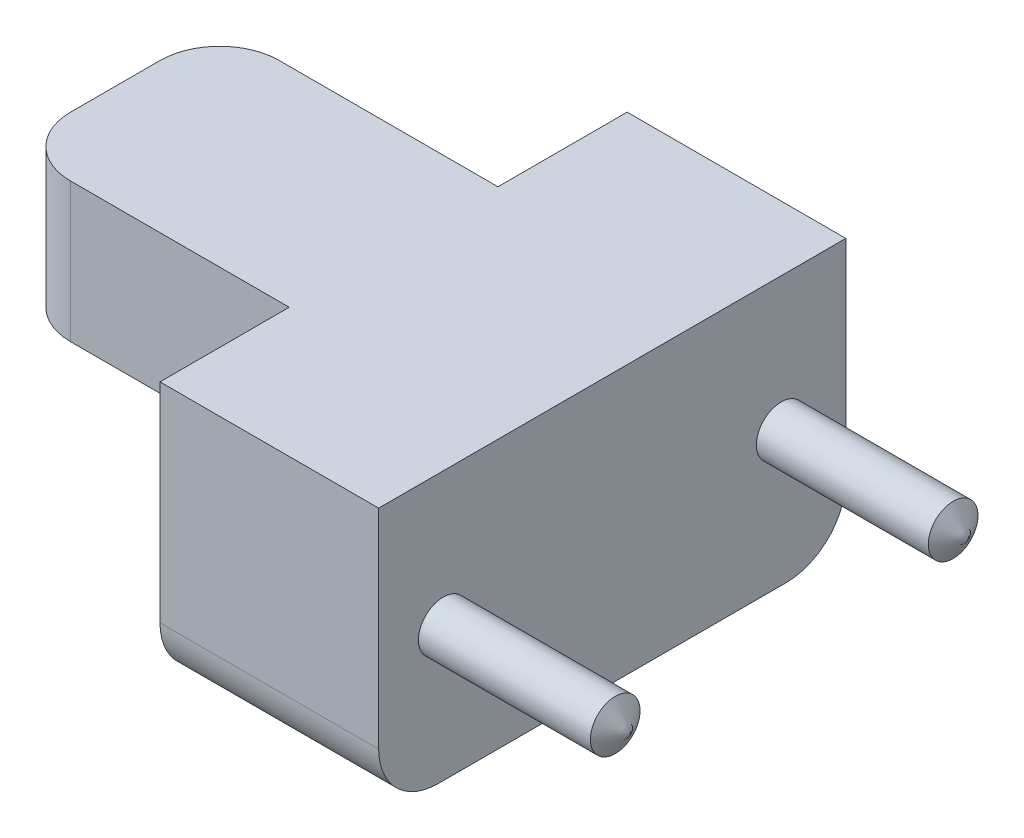
ISO-10303-21;
HEADER;
FILE_DESCRIPTION(('STEP AP214'),'2;1');
FILE_NAME('part.step','',(''),(''),'','','');
FILE_SCHEMA(('AUTOMOTIVE_DESIGN { 1 0 10303 214 1 1 1 1 }'));
ENDSEC;
DATA;
#1=APPLICATION_CONTEXT('core data for automotive mechanical design processes');
#2=APPLICATION_PROTOCOL_DEFINITION('international standard','automotive_design',2000,#1);
#3=PRODUCT_CONTEXT('',#1,'mechanical');
#4=PRODUCT('Part','Part','',(#3));
#5=PRODUCT_RELATED_PRODUCT_CATEGORY('part','',(#4));
#6=PRODUCT_DEFINITION_FORMATION('','',#4);
#7=PRODUCT_DEFINITION_CONTEXT('part definition',#1,'design');
#8=PRODUCT_DEFINITION('design','',#6,#7);
#9=PRODUCT_DEFINITION_SHAPE('','',#8);
#10=(LENGTH_UNIT() NAMED_UNIT(*) SI_UNIT(.MILLI.,.METRE.));
#11=(NAMED_UNIT(*) PLANE_ANGLE_UNIT() SI_UNIT($,.RADIAN.));
#12=(NAMED_UNIT(*) SI_UNIT($,.STERADIAN.) SOLID_ANGLE_UNIT());
#13=UNCERTAINTY_MEASURE_WITH_UNIT(LENGTH_MEASURE(1.E-05),#10,'distance_accuracy_value','');
#14=(GEOMETRIC_REPRESENTATION_CONTEXT(3) GLOBAL_UNCERTAINTY_ASSIGNED_CONTEXT((#13)) GLOBAL_UNIT_ASSIGNED_CONTEXT((#10,
#11,#12)) REPRESENTATION_CONTEXT('',''));
#15=CARTESIAN_POINT('',(0.,0.,0.));
#16=DIRECTION('',(0.,0.,1.));
#17=DIRECTION('',(1.,0.,0.));
#18=AXIS2_PLACEMENT_3D('',#15,#16,#17);
#19=CARTESIAN_POINT('',(0.,27.,-23.501));
#20=DIRECTION('',(1.,0.,0.));
#21=DIRECTION('',(0.,0.,-1.));
#22=AXIS2_PLACEMENT_3D('',#19,#20,#21);
#23=PLANE('',#22);
#24=DIRECTION('',(0.,-1.,0.));
#25=VECTOR('',#24,1.);
#26=CARTESIAN_POINT('',(0.,27.,-10.5));
#27=LINE('',#26,#25);
#28=CARTESIAN_POINT('',(0.,27.,-10.5));
#29=VERTEX_POINT('',#28);
#30=CARTESIAN_POINT('',(0.,13.,-10.5));
#31=VERTEX_POINT('',#30);
#32=EDGE_CURVE('E247',#29,#31,#27,.T.);
#33=ORIENTED_EDGE('',*,*,#32,.F.);
#34=DIRECTION('',(0.,0.,1.));
#35=VECTOR('',#34,1.);
#36=CARTESIAN_POINT('',(0.,27.,-23.501));
#37=LINE('',#36,#35);
#38=CARTESIAN_POINT('',(0.,27.,-23.501));
#39=VERTEX_POINT('',#38);
#40=EDGE_CURVE('E258',#39,#29,#37,.T.);
#41=ORIENTED_EDGE('',*,*,#40,.F.);
#42=DIRECTION('',(0.,-1.,0.));
#43=VECTOR('',#42,1.);
#44=CARTESIAN_POINT('',(0.,27.,-23.501));
#45=LINE('',#44,#43);
#46=CARTESIAN_POINT('',(0.,6.,-23.501));
#47=VERTEX_POINT('',#46);
#48=EDGE_CURVE('E212',#39,#47,#45,.T.);
#49=ORIENTED_EDGE('',*,*,#48,.T.);
#50=CARTESIAN_POINT('',(0.,6.,-17.501));
#51=DIRECTION('',(1.,0.,0.));
#52=DIRECTION('',(0.,0.,-1.));
#53=AXIS2_PLACEMENT_3D('',#50,#51,#52);
#54=CIRCLE('',#53,6.);
#55=CARTESIAN_POINT('',(0.,0.,-17.501));
#56=VERTEX_POINT('',#55);
#57=EDGE_CURVE('E224',#47,#56,#54,.F.);
#58=ORIENTED_EDGE('',*,*,#57,.T.);
#59=DIRECTION('',(0.,0.,1.));
#60=VECTOR('',#59,1.);
#61=CARTESIAN_POINT('',(0.,0.,-23.501));
#62=LINE('',#61,#60);
#63=CARTESIAN_POINT('',(0.,0.,17.501));
#64=VERTEX_POINT('',#63);
#65=EDGE_CURVE('E248',#56,#64,#62,.T.);
#66=ORIENTED_EDGE('',*,*,#65,.T.);
#67=CARTESIAN_POINT('',(0.,6.,17.501));
#68=DIRECTION('',(1.,0.,0.));
#69=DIRECTION('',(0.,0.,-1.));
#70=AXIS2_PLACEMENT_3D('',#67,#68,#69);
#71=CIRCLE('',#70,6.);
#72=CARTESIAN_POINT('',(0.,6.,23.501));
#73=VERTEX_POINT('',#72);
#74=EDGE_CURVE('E226',#64,#73,#71,.F.);
#75=ORIENTED_EDGE('',*,*,#74,.T.);
#76=DIRECTION('',(0.,-1.,0.));
#77=VECTOR('',#76,1.);
#78=CARTESIAN_POINT('',(0.,27.,23.501));
#79=LINE('',#78,#77);
#80=CARTESIAN_POINT('',(0.,27.,23.501));
#81=VERTEX_POINT('',#80);
#82=EDGE_CURVE('E205',#81,#73,#79,.T.);
#83=ORIENTED_EDGE('',*,*,#82,.F.);
#84=CARTESIAN_POINT('',(0.,27.,10.5));
#85=VERTEX_POINT('',#84);
#86=EDGE_CURVE('E262',#85,#81,#37,.T.);
#87=ORIENTED_EDGE('',*,*,#86,.F.);
#88=DIRECTION('',(0.,1.,0.));
#89=VECTOR('',#88,1.);
#90=CARTESIAN_POINT('',(0.,27.,10.5));
#91=LINE('',#90,#89);
#92=CARTESIAN_POINT('',(0.,13.,10.5));
#93=VERTEX_POINT('',#92);
#94=EDGE_CURVE('E284',#93,#85,#91,.T.);
#95=ORIENTED_EDGE('',*,*,#94,.F.);
#96=DIRECTION('',(0.,0.,1.));
#97=VECTOR('',#96,1.);
#98=CARTESIAN_POINT('',(0.,13.,-10.5));
#99=LINE('',#98,#97);
#100=EDGE_CURVE('E288',#31,#93,#99,.T.);
#101=ORIENTED_EDGE('',*,*,#100,.F.);
#102=EDGE_LOOP('',(#33,#41,#49,#58,#66,#75,#83,#87,#95,#101));
#103=FACE_BOUND('',#102,.T.);
#104=ADVANCED_FACE('F34',(#103),#23,.F.);
#105=CARTESIAN_POINT('',(0.,27.,23.501));
#106=DIRECTION('',(0.,0.,-1.));
#107=DIRECTION('',(-1.,0.,0.));
#108=AXIS2_PLACEMENT_3D('',#105,#106,#107);
#109=PLANE('',#108);
#110=ORIENTED_EDGE('',*,*,#82,.T.);
#111=DIRECTION('',(1.,0.,0.));
#112=VECTOR('',#111,1.);
#113=CARTESIAN_POINT('',(0.,6.,23.501));
#114=LINE('',#113,#112);
#115=CARTESIAN_POINT('',(22.,6.,23.501));
#116=VERTEX_POINT('',#115);
#117=EDGE_CURVE('E209',#73,#116,#114,.T.);
#118=ORIENTED_EDGE('',*,*,#117,.T.);
#119=DIRECTION('',(0.,-1.,0.));
#120=VECTOR('',#119,1.);
#121=CARTESIAN_POINT('',(22.,27.,23.501));
#122=LINE('',#121,#120);
#123=CARTESIAN_POINT('',(22.,27.,23.501));
#124=VERTEX_POINT('',#123);
#125=EDGE_CURVE('E197',#124,#116,#122,.T.);
#126=ORIENTED_EDGE('',*,*,#125,.F.);
#127=DIRECTION('',(1.,0.,0.));
#128=VECTOR('',#127,1.);
#129=CARTESIAN_POINT('',(0.,27.,23.501));
#130=LINE('',#129,#128);
#131=EDGE_CURVE('E261',#81,#124,#130,.T.);
#132=ORIENTED_EDGE('',*,*,#131,.F.);
#133=EDGE_LOOP('',(#110,#118,#126,#132));
#134=FACE_BOUND('',#133,.T.);
#135=ADVANCED_FACE('F141',(#134),#109,.F.);
#136=CARTESIAN_POINT('',(22.,27.,-23.501));
#137=DIRECTION('',(-1.,0.,0.));
#138=DIRECTION('',(0.,0.,1.));
#139=AXIS2_PLACEMENT_3D('',#136,#137,#138);
#140=PLANE('',#139);
#141=CARTESIAN_POINT('',(22.,13.5,17.));
#142=DIRECTION('',(-1.,0.,0.));
#143=DIRECTION('',(0.,0.,1.));
#144=AXIS2_PLACEMENT_3D('',#141,#142,#143);
#145=CIRCLE('',#144,2.5);
#146=CARTESIAN_POINT('',(22.,13.5,19.5));
#147=VERTEX_POINT('',#146);
#148=EDGE_CURVE('E11',#147,#147,#145,.F.);
#149=ORIENTED_EDGE('',*,*,#148,.F.);
#150=EDGE_LOOP('',(#149));
#151=FACE_BOUND('',#150,.T.);
#152=CARTESIAN_POINT('',(22.,13.5,-17.));
#153=DIRECTION('',(-1.,0.,0.));
#154=DIRECTION('',(0.,0.,1.));
#155=AXIS2_PLACEMENT_3D('',#152,#153,#154);
#156=CIRCLE('',#155,2.5);
#157=CARTESIAN_POINT('',(22.,13.5,-14.5));
#158=VERTEX_POINT('',#157);
#159=EDGE_CURVE('E42',#158,#158,#156,.F.);
#160=ORIENTED_EDGE('',*,*,#159,.F.);
#161=EDGE_LOOP('',(#160));
#162=FACE_BOUND('',#161,.T.);
#163=ORIENTED_EDGE('',*,*,#125,.T.);
#164=CARTESIAN_POINT('',(22.,6.,17.501));
#165=DIRECTION('',(-1.,0.,0.));
#166=DIRECTION('',(0.,0.,1.));
#167=AXIS2_PLACEMENT_3D('',#164,#165,#166);
#168=CIRCLE('',#167,6.);
#169=CARTESIAN_POINT('',(22.,0.,17.501));
#170=VERTEX_POINT('',#169);
#171=EDGE_CURVE('E199',#116,#170,#168,.F.);
#172=ORIENTED_EDGE('',*,*,#171,.T.);
#173=DIRECTION('',(0.,0.,-1.));
#174=VECTOR('',#173,1.);
#175=CARTESIAN_POINT('',(22.,0.,-23.501));
#176=LINE('',#175,#174);
#177=CARTESIAN_POINT('',(22.,0.,-17.501));
#178=VERTEX_POINT('',#177);
#179=EDGE_CURVE('E252',#170,#178,#176,.T.);
#180=ORIENTED_EDGE('',*,*,#179,.T.);
#181=CARTESIAN_POINT('',(22.,6.,-17.501));
#182=DIRECTION('',(-1.,0.,0.));
#183=DIRECTION('',(0.,0.,1.));
#184=AXIS2_PLACEMENT_3D('',#181,#182,#183);
#185=CIRCLE('',#184,6.);
#186=CARTESIAN_POINT('',(22.,6.,-23.501));
#187=VERTEX_POINT('',#186);
#188=EDGE_CURVE('E217',#178,#187,#185,.F.);
#189=ORIENTED_EDGE('',*,*,#188,.T.);
#190=DIRECTION('',(0.,-1.,0.));
#191=VECTOR('',#190,1.);
#192=CARTESIAN_POINT('',(22.,27.,-23.501));
#193=LINE('',#192,#191);
#194=CARTESIAN_POINT('',(22.,27.,-23.501));
#195=VERTEX_POINT('',#194);
#196=EDGE_CURVE('E206',#195,#187,#193,.T.);
#197=ORIENTED_EDGE('',*,*,#196,.F.);
#198=DIRECTION('',(0.,0.,-1.));
#199=VECTOR('',#198,1.);
#200=CARTESIAN_POINT('',(22.,27.,-23.501));
#201=LINE('',#200,#199);
#202=EDGE_CURVE('E202',#124,#195,#201,.T.);
#203=ORIENTED_EDGE('',*,*,#202,.F.);
#204=EDGE_LOOP('',(#163,#172,#180,#189,#197,#203));
#205=FACE_BOUND('',#204,.T.);
#206=ADVANCED_FACE('F147',(#151,#162,#205),#140,.F.);
#207=CARTESIAN_POINT('',(0.,27.,-23.501));
#208=DIRECTION('',(0.,0.,1.));
#209=DIRECTION('',(1.,0.,0.));
#210=AXIS2_PLACEMENT_3D('',#207,#208,#209);
#211=PLANE('',#210);
#212=ORIENTED_EDGE('',*,*,#196,.T.);
#213=DIRECTION('',(-1.,0.,0.));
#214=VECTOR('',#213,1.);
#215=CARTESIAN_POINT('',(0.,6.,-23.501));
#216=LINE('',#215,#214);
#217=EDGE_CURVE('E228',#187,#47,#216,.T.);
#218=ORIENTED_EDGE('',*,*,#217,.T.);
#219=ORIENTED_EDGE('',*,*,#48,.F.);
#220=DIRECTION('',(-1.,0.,0.));
#221=VECTOR('',#220,1.);
#222=CARTESIAN_POINT('',(0.,27.,-23.501));
#223=LINE('',#222,#221);
#224=EDGE_CURVE('E265',#195,#39,#223,.T.);
#225=ORIENTED_EDGE('',*,*,#224,.F.);
#226=EDGE_LOOP('',(#212,#218,#219,#225));
#227=FACE_BOUND('',#226,.T.);
#228=ADVANCED_FACE('F192',(#227),#211,.F.);
#229=CARTESIAN_POINT('',(0.,27.,0.));
#230=DIRECTION('',(0.,1.,0.));
#231=DIRECTION('',(0.,0.,1.));
#232=AXIS2_PLACEMENT_3D('',#229,#230,#231);
#233=PLANE('',#232);
#234=DIRECTION('',(1.,0.,0.));
#235=VECTOR('',#234,1.);
#236=CARTESIAN_POINT('',(-28.,27.,-10.5));
#237=LINE('',#236,#235);
#238=CARTESIAN_POINT('',(-22.,27.,-10.5));
#239=VERTEX_POINT('',#238);
#240=EDGE_CURVE('E295',#239,#29,#237,.T.);
#241=ORIENTED_EDGE('',*,*,#240,.F.);
#242=CARTESIAN_POINT('',(-22.,27.,-4.5));
#243=DIRECTION('',(0.,1.,0.));
#244=DIRECTION('',(0.,0.,1.));
#245=AXIS2_PLACEMENT_3D('',#242,#243,#244);
#246=CIRCLE('',#245,6.);
#247=CARTESIAN_POINT('',(-28.,27.,-4.5));
#248=VERTEX_POINT('',#247);
#249=EDGE_CURVE('E177',#239,#248,#246,.T.);
#250=ORIENTED_EDGE('',*,*,#249,.T.);
#251=DIRECTION('',(0.,0.,-1.));
#252=VECTOR('',#251,1.);
#253=CARTESIAN_POINT('',(-28.,27.,-10.5));
#254=LINE('',#253,#252);
#255=CARTESIAN_POINT('',(-28.,27.,4.5));
#256=VERTEX_POINT('',#255);
#257=EDGE_CURVE('E290',#256,#248,#254,.T.);
#258=ORIENTED_EDGE('',*,*,#257,.F.);
#259=CARTESIAN_POINT('',(-22.,27.,4.5));
#260=DIRECTION('',(0.,1.,0.));
#261=DIRECTION('',(0.,0.,1.));
#262=AXIS2_PLACEMENT_3D('',#259,#260,#261);
#263=CIRCLE('',#262,6.);
#264=CARTESIAN_POINT('',(-22.,27.,10.5));
#265=VERTEX_POINT('',#264);
#266=EDGE_CURVE('E49',#256,#265,#263,.T.);
#267=ORIENTED_EDGE('',*,*,#266,.T.);
#268=DIRECTION('',(1.,0.,0.));
#269=VECTOR('',#268,1.);
#270=CARTESIAN_POINT('',(-28.,27.,10.5));
#271=LINE('',#270,#269);
#272=EDGE_CURVE('E254',#265,#85,#271,.T.);
#273=ORIENTED_EDGE('',*,*,#272,.T.);
#274=ORIENTED_EDGE('',*,*,#86,.T.);
#275=ORIENTED_EDGE('',*,*,#131,.T.);
#276=ORIENTED_EDGE('',*,*,#202,.T.);
#277=ORIENTED_EDGE('',*,*,#224,.T.);
#278=ORIENTED_EDGE('',*,*,#40,.T.);
#279=EDGE_LOOP('',(#241,#250,#258,#267,#273,#274,#275,#276,#277,#278));
#280=FACE_BOUND('',#279,.T.);
#281=ADVANCED_FACE('F296',(#280),#233,.T.);
#282=CARTESIAN_POINT('',(0.,0.,0.));
#283=DIRECTION('',(0.,1.,0.));
#284=DIRECTION('',(0.,0.,1.));
#285=AXIS2_PLACEMENT_3D('',#282,#283,#284);
#286=PLANE('',#285);
#287=ORIENTED_EDGE('',*,*,#179,.F.);
#288=DIRECTION('',(1.,0.,0.));
#289=VECTOR('',#288,1.);
#290=CARTESIAN_POINT('',(0.,0.,17.501));
#291=LINE('',#290,#289);
#292=EDGE_CURVE('E222',#170,#64,#291,.F.);
#293=ORIENTED_EDGE('',*,*,#292,.T.);
#294=ORIENTED_EDGE('',*,*,#65,.F.);
#295=DIRECTION('',(-1.,0.,0.));
#296=VECTOR('',#295,1.);
#297=CARTESIAN_POINT('',(0.,0.,-17.501));
#298=LINE('',#297,#296);
#299=EDGE_CURVE('E220',#56,#178,#298,.F.);
#300=ORIENTED_EDGE('',*,*,#299,.T.);
#301=EDGE_LOOP('',(#287,#293,#294,#300));
#302=FACE_BOUND('',#301,.T.);
#303=ADVANCED_FACE('F157',(#302),#286,.F.);
#304=CARTESIAN_POINT('',(0.,6.,17.501));
#305=DIRECTION('',(1.,0.,0.));
#306=DIRECTION('',(0.,0.,-1.));
#307=AXIS2_PLACEMENT_3D('',#304,#305,#306);
#308=CYLINDRICAL_SURFACE('',#307,6.);
#309=ORIENTED_EDGE('',*,*,#74,.F.);
#310=ORIENTED_EDGE('',*,*,#292,.F.);
#311=ORIENTED_EDGE('',*,*,#171,.F.);
#312=ORIENTED_EDGE('',*,*,#117,.F.);
#313=EDGE_LOOP('',(#309,#310,#311,#312));
#314=FACE_BOUND('',#313,.T.);
#315=ADVANCED_FACE('F153',(#314),#308,.T.);
#316=CARTESIAN_POINT('',(0.,6.,-17.501));
#317=DIRECTION('',(-1.,0.,0.));
#318=DIRECTION('',(0.,0.,1.));
#319=AXIS2_PLACEMENT_3D('',#316,#317,#318);
#320=CYLINDRICAL_SURFACE('',#319,6.);
#321=ORIENTED_EDGE('',*,*,#188,.F.);
#322=ORIENTED_EDGE('',*,*,#299,.F.);
#323=ORIENTED_EDGE('',*,*,#57,.F.);
#324=ORIENTED_EDGE('',*,*,#217,.F.);
#325=EDGE_LOOP('',(#321,#322,#323,#324));
#326=FACE_BOUND('',#325,.T.);
#327=ADVANCED_FACE('F156',(#326),#320,.T.);
#328=CARTESIAN_POINT('',(-28.,27.,-10.5));
#329=DIRECTION('',(0.,0.,1.));
#330=DIRECTION('',(0.,-1.,0.));
#331=AXIS2_PLACEMENT_3D('',#328,#329,#330);
#332=PLANE('',#331);
#333=DIRECTION('',(1.,0.,0.));
#334=VECTOR('',#333,1.);
#335=CARTESIAN_POINT('',(-28.,13.,-10.5));
#336=LINE('',#335,#334);
#337=CARTESIAN_POINT('',(-22.,13.,-10.5));
#338=VERTEX_POINT('',#337);
#339=EDGE_CURVE('E242',#338,#31,#336,.T.);
#340=ORIENTED_EDGE('',*,*,#339,.F.);
#341=DIRECTION('',(0.,-1.,0.));
#342=VECTOR('',#341,1.);
#343=CARTESIAN_POINT('',(-22.,27.,-10.5));
#344=LINE('',#343,#342);
#345=EDGE_CURVE('E57',#338,#239,#344,.F.);
#346=ORIENTED_EDGE('',*,*,#345,.T.);
#347=ORIENTED_EDGE('',*,*,#240,.T.);
#348=ORIENTED_EDGE('',*,*,#32,.T.);
#349=EDGE_LOOP('',(#340,#346,#347,#348));
#350=FACE_BOUND('',#349,.T.);
#351=ADVANCED_FACE('F160',(#350),#332,.F.);
#352=CARTESIAN_POINT('',(-28.,13.,-10.5));
#353=DIRECTION('',(0.,1.,0.));
#354=DIRECTION('',(0.,0.,1.));
#355=AXIS2_PLACEMENT_3D('',#352,#353,#354);
#356=PLANE('',#355);
#357=DIRECTION('',(0.,0.,1.));
#358=VECTOR('',#357,1.);
#359=CARTESIAN_POINT('',(-28.,13.,-10.5));
#360=LINE('',#359,#358);
#361=CARTESIAN_POINT('',(-28.,13.,-4.5));
#362=VERTEX_POINT('',#361);
#363=CARTESIAN_POINT('',(-28.,13.,4.5));
#364=VERTEX_POINT('',#363);
#365=EDGE_CURVE('E245',#362,#364,#360,.T.);
#366=ORIENTED_EDGE('',*,*,#365,.F.);
#367=CARTESIAN_POINT('',(-22.,13.,-4.5));
#368=DIRECTION('',(0.,1.,0.));
#369=DIRECTION('',(0.,0.,1.));
#370=AXIS2_PLACEMENT_3D('',#367,#368,#369);
#371=CIRCLE('',#370,6.);
#372=EDGE_CURVE('E237',#362,#338,#371,.F.);
#373=ORIENTED_EDGE('',*,*,#372,.T.);
#374=ORIENTED_EDGE('',*,*,#339,.T.);
#375=ORIENTED_EDGE('',*,*,#100,.T.);
#376=DIRECTION('',(1.,0.,0.));
#377=VECTOR('',#376,1.);
#378=CARTESIAN_POINT('',(-28.,13.,10.5));
#379=LINE('',#378,#377);
#380=CARTESIAN_POINT('',(-22.,13.,10.5));
#381=VERTEX_POINT('',#380);
#382=EDGE_CURVE('E249',#381,#93,#379,.T.);
#383=ORIENTED_EDGE('',*,*,#382,.F.);
#384=CARTESIAN_POINT('',(-22.,13.,4.5));
#385=DIRECTION('',(0.,1.,0.));
#386=DIRECTION('',(0.,0.,1.));
#387=AXIS2_PLACEMENT_3D('',#384,#385,#386);
#388=CIRCLE('',#387,6.);
#389=EDGE_CURVE('E235',#381,#364,#388,.F.);
#390=ORIENTED_EDGE('',*,*,#389,.T.);
#391=EDGE_LOOP('',(#366,#373,#374,#375,#383,#390));
#392=FACE_BOUND('',#391,.T.);
#393=ADVANCED_FACE('F240',(#392),#356,.F.);
#394=CARTESIAN_POINT('',(-28.,27.,10.5));
#395=DIRECTION('',(0.,0.,-1.));
#396=DIRECTION('',(0.,1.,0.));
#397=AXIS2_PLACEMENT_3D('',#394,#395,#396);
#398=PLANE('',#397);
#399=ORIENTED_EDGE('',*,*,#272,.F.);
#400=DIRECTION('',(0.,1.,0.));
#401=VECTOR('',#400,1.);
#402=CARTESIAN_POINT('',(-22.,13.,10.5));
#403=LINE('',#402,#401);
#404=EDGE_CURVE('E181',#265,#381,#403,.F.);
#405=ORIENTED_EDGE('',*,*,#404,.T.);
#406=ORIENTED_EDGE('',*,*,#382,.T.);
#407=ORIENTED_EDGE('',*,*,#94,.T.);
#408=EDGE_LOOP('',(#399,#405,#406,#407));
#409=FACE_BOUND('',#408,.T.);
#410=ADVANCED_FACE('F172',(#409),#398,.F.);
#411=CARTESIAN_POINT('',(-28.,0.,0.));
#412=DIRECTION('',(-1.,0.,0.));
#413=DIRECTION('',(0.,0.,1.));
#414=AXIS2_PLACEMENT_3D('',#411,#412,#413);
#415=PLANE('',#414);
#416=ORIENTED_EDGE('',*,*,#257,.T.);
#417=DIRECTION('',(0.,-1.,0.));
#418=VECTOR('',#417,1.);
#419=CARTESIAN_POINT('',(-28.,13.,-4.5));
#420=LINE('',#419,#418);
#421=EDGE_CURVE('E179',#248,#362,#420,.T.);
#422=ORIENTED_EDGE('',*,*,#421,.T.);
#423=ORIENTED_EDGE('',*,*,#365,.T.);
#424=DIRECTION('',(0.,1.,0.));
#425=VECTOR('',#424,1.);
#426=CARTESIAN_POINT('',(-28.,27.,4.5));
#427=LINE('',#426,#425);
#428=EDGE_CURVE('E231',#364,#256,#427,.T.);
#429=ORIENTED_EDGE('',*,*,#428,.T.);
#430=EDGE_LOOP('',(#416,#422,#423,#429));
#431=FACE_BOUND('',#430,.T.);
#432=ADVANCED_FACE('F164',(#431),#415,.T.);
#433=CARTESIAN_POINT('',(-22.,0.,-4.50000000000001));
#434=DIRECTION('',(0.,1.,0.));
#435=DIRECTION('',(0.,0.,1.));
#436=AXIS2_PLACEMENT_3D('',#433,#434,#435);
#437=CYLINDRICAL_SURFACE('',#436,6.);
#438=ORIENTED_EDGE('',*,*,#249,.F.);
#439=ORIENTED_EDGE('',*,*,#345,.F.);
#440=ORIENTED_EDGE('',*,*,#372,.F.);
#441=ORIENTED_EDGE('',*,*,#421,.F.);
#442=EDGE_LOOP('',(#438,#439,#440,#441));
#443=FACE_BOUND('',#442,.T.);
#444=ADVANCED_FACE('F162',(#443),#437,.T.);
#445=CARTESIAN_POINT('',(-22.,0.,4.5));
#446=DIRECTION('',(0.,-1.,0.));
#447=DIRECTION('',(0.,0.,-1.));
#448=AXIS2_PLACEMENT_3D('',#445,#446,#447);
#449=CYLINDRICAL_SURFACE('',#448,6.);
#450=ORIENTED_EDGE('',*,*,#389,.F.);
#451=ORIENTED_EDGE('',*,*,#404,.F.);
#452=ORIENTED_EDGE('',*,*,#266,.F.);
#453=ORIENTED_EDGE('',*,*,#428,.F.);
#454=EDGE_LOOP('',(#450,#451,#452,#453));
#455=FACE_BOUND('',#454,.T.);
#456=ADVANCED_FACE('F36',(#455),#449,.T.);
#457=CARTESIAN_POINT('',(39.3,13.5,-17.));
#458=DIRECTION('',(-1.,0.,0.));
#459=DIRECTION('',(0.,0.,1.));
#460=AXIS2_PLACEMENT_3D('',#457,#458,#459);
#461=CYLINDRICAL_SURFACE('',#460,2.5);
#462=CARTESIAN_POINT('',(39.3,13.5,-17.));
#463=DIRECTION('',(1.,0.,0.));
#464=DIRECTION('',(0.,0.,-1.));
#465=AXIS2_PLACEMENT_3D('',#462,#463,#464);
#466=CIRCLE('',#465,2.5);
#467=CARTESIAN_POINT('',(39.3,13.5,-19.5));
#468=VERTEX_POINT('',#467);
#469=EDGE_CURVE('E324',#468,#468,#466,.T.);
#470=ORIENTED_EDGE('',*,*,#469,.F.);
#471=EDGE_LOOP('',(#470));
#472=FACE_BOUND('',#471,.T.);
#473=ORIENTED_EDGE('',*,*,#159,.T.);
#474=EDGE_LOOP('',(#473));
#475=FACE_BOUND('',#474,.T.);
#476=ADVANCED_FACE('F170',(#472,#475),#461,.T.);
#477=CARTESIAN_POINT('',(39.3,13.5,17.));
#478=DIRECTION('',(-1.,0.,0.));
#479=DIRECTION('',(0.,0.,1.));
#480=AXIS2_PLACEMENT_3D('',#477,#478,#479);
#481=CYLINDRICAL_SURFACE('',#480,2.5);
#482=CARTESIAN_POINT('',(39.3,13.5,17.));
#483=DIRECTION('',(1.,0.,0.));
#484=DIRECTION('',(0.,0.,-1.));
#485=AXIS2_PLACEMENT_3D('',#482,#483,#484);
#486=CIRCLE('',#485,2.5);
#487=CARTESIAN_POINT('',(39.3,13.5,14.5));
#488=VERTEX_POINT('',#487);
#489=EDGE_CURVE('E322',#488,#488,#486,.T.);
#490=ORIENTED_EDGE('',*,*,#489,.F.);
#491=EDGE_LOOP('',(#490));
#492=FACE_BOUND('',#491,.T.);
#493=ORIENTED_EDGE('',*,*,#148,.T.);
#494=EDGE_LOOP('',(#493));
#495=FACE_BOUND('',#494,.T.);
#496=ADVANCED_FACE('F136',(#492,#495),#481,.T.);
#497=CARTESIAN_POINT('',(40.8021515475689,13.5,17.));
#498=DIRECTION('',(-1.,0.,0.));
#499=DIRECTION('',(0.,0.,1.));
#500=AXIS2_PLACEMENT_3D('',#497,#498,#499);
#501=CONICAL_SURFACE('',#500,0.,1.02974425867665);
#502=ORIENTED_EDGE('',*,*,#489,.T.);
#503=EDGE_LOOP('',(#502));
#504=FACE_BOUND('',#503,.T.);
#505=CARTESIAN_POINT('',(40.8021515475689,13.5,17.));
#506=VERTEX_POINT('',#505);
#507=VERTEX_LOOP('',#506);
#508=FACE_BOUND('',#507,.T.);
#509=ADVANCED_FACE('F130',(#504,#508),#501,.T.);
#510=CARTESIAN_POINT('',(40.8021515475689,13.5,-17.));
#511=DIRECTION('',(-1.,0.,0.));
#512=DIRECTION('',(0.,0.,1.));
#513=AXIS2_PLACEMENT_3D('',#510,#511,#512);
#514=CONICAL_SURFACE('',#513,0.,1.02974425867665);
#515=ORIENTED_EDGE('',*,*,#469,.T.);
#516=EDGE_LOOP('',(#515));
#517=FACE_BOUND('',#516,.T.);
#518=CARTESIAN_POINT('',(40.8021515475689,13.5,-17.));
#519=VERTEX_POINT('',#518);
#520=VERTEX_LOOP('',#519);
#521=FACE_BOUND('',#520,.T.);
#522=ADVANCED_FACE('F128',(#517,#521),#514,.T.);
#523=CLOSED_SHELL('',(#104,#135,#206,#228,#281,#303,#315,#327,#351,#393,#410,#432,#444,#456,
#476,#496,#509,#522));
#524=MANIFOLD_SOLID_BREP('B2',#523);
#525=ADVANCED_BREP_SHAPE_REPRESENTATION('',(#18,#524),#14);
#526=SHAPE_DEFINITION_REPRESENTATION(#9,#525);
ENDSEC;
END-ISO-10303-21;
